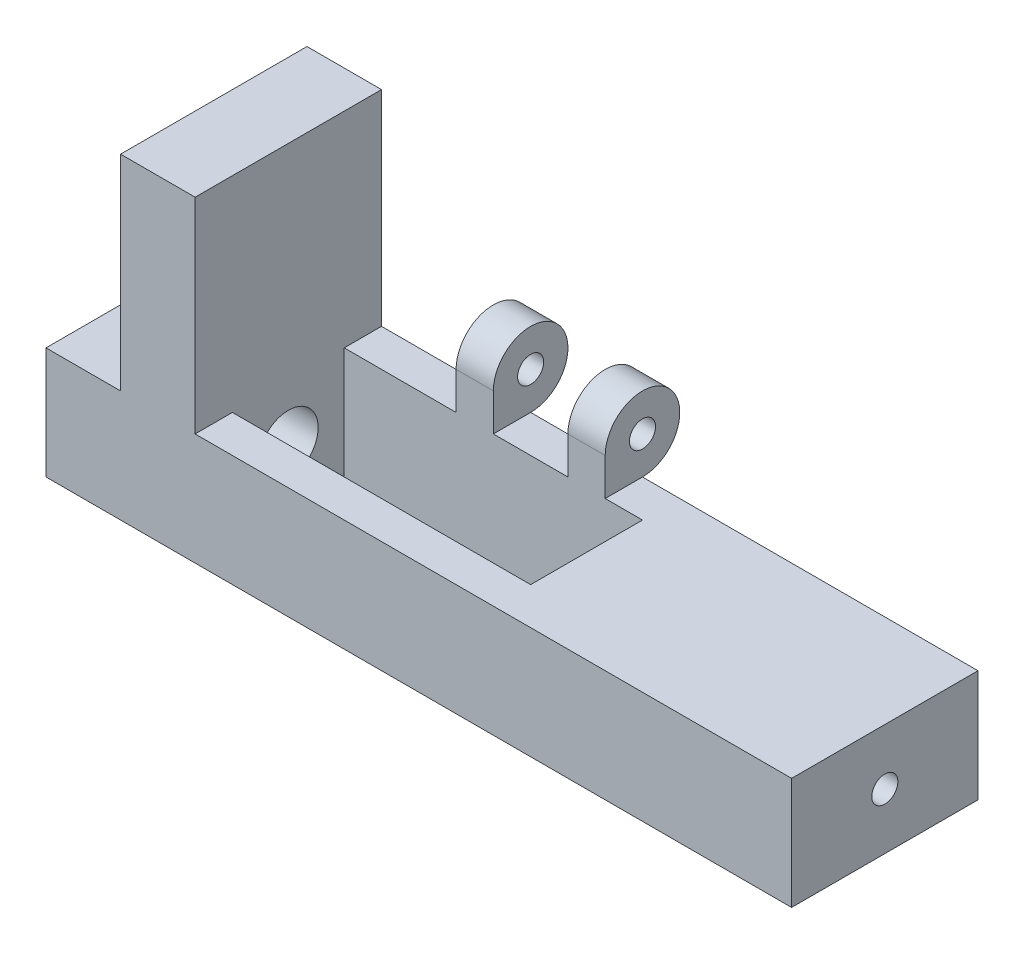
ISO-10303-21;
HEADER;
FILE_DESCRIPTION(('STEP AP214'),'2;1');
FILE_NAME('part.step','',(''),(''),'','','');
FILE_SCHEMA(('AUTOMOTIVE_DESIGN { 1 0 10303 214 1 1 1 1 }'));
ENDSEC;
DATA;
#1=APPLICATION_CONTEXT('core data for automotive mechanical design processes');
#2=APPLICATION_PROTOCOL_DEFINITION('international standard','automotive_design',2000,#1);
#3=PRODUCT_CONTEXT('',#1,'mechanical');
#4=PRODUCT('Part','Part','',(#3));
#5=PRODUCT_RELATED_PRODUCT_CATEGORY('part','',(#4));
#6=PRODUCT_DEFINITION_FORMATION('','',#4);
#7=PRODUCT_DEFINITION_CONTEXT('part definition',#1,'design');
#8=PRODUCT_DEFINITION('design','',#6,#7);
#9=PRODUCT_DEFINITION_SHAPE('','',#8);
#10=(LENGTH_UNIT() NAMED_UNIT(*) SI_UNIT(.MILLI.,.METRE.));
#11=(NAMED_UNIT(*) PLANE_ANGLE_UNIT() SI_UNIT($,.RADIAN.));
#12=(NAMED_UNIT(*) SI_UNIT($,.STERADIAN.) SOLID_ANGLE_UNIT());
#13=UNCERTAINTY_MEASURE_WITH_UNIT(LENGTH_MEASURE(1.E-05),#10,'distance_accuracy_value','');
#14=(GEOMETRIC_REPRESENTATION_CONTEXT(3) GLOBAL_UNCERTAINTY_ASSIGNED_CONTEXT((#13)) GLOBAL_UNIT_ASSIGNED_CONTEXT((#10,
#11,#12)) REPRESENTATION_CONTEXT('',''));
#15=CARTESIAN_POINT('',(0.,0.,0.));
#16=DIRECTION('',(0.,0.,1.));
#17=DIRECTION('',(1.,0.,0.));
#18=AXIS2_PLACEMENT_3D('',#15,#16,#17);
#19=CARTESIAN_POINT('',(-20.,15.,-7.5));
#20=DIRECTION('',(0.,0.,1.));
#21=DIRECTION('',(1.,0.,0.));
#22=AXIS2_PLACEMENT_3D('',#19,#20,#21);
#23=PLANE('',#22);
#24=DIRECTION('',(-1.,0.,0.));
#25=VECTOR('',#24,1.);
#26=CARTESIAN_POINT('',(20.,20.,-7.5));
#27=LINE('',#26,#25);
#28=CARTESIAN_POINT('',(0.,20.,-7.5));
#29=VERTEX_POINT('',#28);
#30=CARTESIAN_POINT('',(-5.,20.,-7.5));
#31=VERTEX_POINT('',#30);
#32=EDGE_CURVE('E255',#29,#31,#27,.T.);
#33=ORIENTED_EDGE('',*,*,#32,.T.);
#34=DIRECTION('',(0.,-1.,0.));
#35=VECTOR('',#34,1.);
#36=CARTESIAN_POINT('',(-5.,42.501,-7.5));
#37=LINE('',#36,#35);
#38=CARTESIAN_POINT('',(-5.,15.,-7.5));
#39=VERTEX_POINT('',#38);
#40=EDGE_CURVE('E194',#31,#39,#37,.T.);
#41=ORIENTED_EDGE('',*,*,#40,.T.);
#42=DIRECTION('',(1.,0.,0.));
#43=VECTOR('',#42,1.);
#44=CARTESIAN_POINT('',(-20.,15.,-7.5));
#45=LINE('',#44,#43);
#46=CARTESIAN_POINT('',(-20.,15.,-7.5));
#47=VERTEX_POINT('',#46);
#48=EDGE_CURVE('E201',#47,#39,#45,.T.);
#49=ORIENTED_EDGE('',*,*,#48,.F.);
#50=DIRECTION('',(0.,-1.,0.));
#51=VECTOR('',#50,1.);
#52=CARTESIAN_POINT('',(-20.,15.,-7.5));
#53=LINE('',#52,#51);
#54=CARTESIAN_POINT('',(-20.,0.,-7.5));
#55=VERTEX_POINT('',#54);
#56=EDGE_CURVE('E200',#47,#55,#53,.T.);
#57=ORIENTED_EDGE('',*,*,#56,.T.);
#58=DIRECTION('',(-1.,0.,0.));
#59=VECTOR('',#58,1.);
#60=CARTESIAN_POINT('',(-20.,0.,-7.5));
#61=LINE('',#60,#59);
#62=CARTESIAN_POINT('',(20.,0.,-7.5));
#63=VERTEX_POINT('',#62);
#64=EDGE_CURVE('E310',#63,#55,#61,.T.);
#65=ORIENTED_EDGE('',*,*,#64,.F.);
#66=DIRECTION('',(0.,-1.,0.));
#67=VECTOR('',#66,1.);
#68=CARTESIAN_POINT('',(20.,15.,-7.5));
#69=LINE('',#68,#67);
#70=CARTESIAN_POINT('',(20.,15.,-7.5));
#71=VERTEX_POINT('',#70);
#72=EDGE_CURVE('E323',#71,#63,#69,.T.);
#73=ORIENTED_EDGE('',*,*,#72,.F.);
#74=DIRECTION('',(1.,0.,0.));
#75=VECTOR('',#74,1.);
#76=CARTESIAN_POINT('',(20.,15.,-7.5));
#77=LINE('',#76,#75);
#78=CARTESIAN_POINT('',(15.,15.,-7.5));
#79=VERTEX_POINT('',#78);
#80=EDGE_CURVE('E246',#79,#71,#77,.T.);
#81=ORIENTED_EDGE('',*,*,#80,.F.);
#82=DIRECTION('',(0.,-1.,0.));
#83=VECTOR('',#82,1.);
#84=CARTESIAN_POINT('',(15.,42.501,-7.5));
#85=LINE('',#84,#83);
#86=CARTESIAN_POINT('',(15.,20.,-7.5));
#87=VERTEX_POINT('',#86);
#88=EDGE_CURVE('E244',#87,#79,#85,.T.);
#89=ORIENTED_EDGE('',*,*,#88,.F.);
#90=CARTESIAN_POINT('',(10.,20.,-7.5));
#91=VERTEX_POINT('',#90);
#92=EDGE_CURVE('E258',#87,#91,#27,.T.);
#93=ORIENTED_EDGE('',*,*,#92,.T.);
#94=DIRECTION('',(0.,-1.,0.));
#95=VECTOR('',#94,1.);
#96=CARTESIAN_POINT('',(10.,42.501,-7.5));
#97=LINE('',#96,#95);
#98=CARTESIAN_POINT('',(10.,15.,-7.5));
#99=VERTEX_POINT('',#98);
#100=EDGE_CURVE('E224',#91,#99,#97,.T.);
#101=ORIENTED_EDGE('',*,*,#100,.T.);
#102=DIRECTION('',(1.,0.,0.));
#103=VECTOR('',#102,1.);
#104=CARTESIAN_POINT('',(0.,15.,-7.5));
#105=LINE('',#104,#103);
#106=CARTESIAN_POINT('',(0.,15.,-7.5));
#107=VERTEX_POINT('',#106);
#108=EDGE_CURVE('E228',#107,#99,#105,.T.);
#109=ORIENTED_EDGE('',*,*,#108,.F.);
#110=DIRECTION('',(0.,-1.,0.));
#111=VECTOR('',#110,1.);
#112=CARTESIAN_POINT('',(0.,42.501,-7.5));
#113=LINE('',#112,#111);
#114=EDGE_CURVE('E222',#29,#107,#113,.T.);
#115=ORIENTED_EDGE('',*,*,#114,.F.);
#116=EDGE_LOOP('',(#33,#41,#49,#57,#65,#73,#81,#89,#93,#101,#109,#115));
#117=FACE_BOUND('',#116,.T.);
#118=ADVANCED_FACE('F39',(#117),#23,.T.);
#119=CARTESIAN_POINT('',(20.,20.,-12.5));
#120=DIRECTION('',(-1.,0.,0.));
#121=DIRECTION('',(0.,0.,1.));
#122=AXIS2_PLACEMENT_3D('',#119,#120,#121);
#123=CYLINDRICAL_SURFACE('',#122,5.);
#124=CARTESIAN_POINT('',(-5.,20.,-12.5));
#125=DIRECTION('',(-1.,0.,0.));
#126=DIRECTION('',(0.,0.,1.));
#127=AXIS2_PLACEMENT_3D('',#124,#125,#126);
#128=CIRCLE('',#127,5.);
#129=CARTESIAN_POINT('',(-5.,15.,-12.5));
#130=VERTEX_POINT('',#129);
#131=EDGE_CURVE('E202',#130,#31,#128,.F.);
#132=ORIENTED_EDGE('',*,*,#131,.T.);
#133=ORIENTED_EDGE('',*,*,#32,.F.);
#134=CARTESIAN_POINT('',(0.,20.,-12.5));
#135=DIRECTION('',(1.,0.,0.));
#136=DIRECTION('',(0.,0.,-1.));
#137=AXIS2_PLACEMENT_3D('',#134,#135,#136);
#138=CIRCLE('',#137,5.);
#139=CARTESIAN_POINT('',(0.,15.,-12.5));
#140=VERTEX_POINT('',#139);
#141=EDGE_CURVE('E206',#29,#140,#138,.F.);
#142=ORIENTED_EDGE('',*,*,#141,.T.);
#143=DIRECTION('',(-1.,0.,0.));
#144=VECTOR('',#143,1.);
#145=CARTESIAN_POINT('',(20.,15.,-12.5));
#146=LINE('',#145,#144);
#147=EDGE_CURVE('E214',#140,#130,#146,.T.);
#148=ORIENTED_EDGE('',*,*,#147,.T.);
#149=EDGE_LOOP('',(#132,#133,#142,#148));
#150=FACE_BOUND('',#149,.T.);
#151=ADVANCED_FACE('F380',(#150),#123,.T.);
#152=CARTESIAN_POINT('',(10.,20.,-12.5));
#153=DIRECTION('',(-1.,0.,0.));
#154=DIRECTION('',(0.,0.,1.));
#155=AXIS2_PLACEMENT_3D('',#152,#153,#154);
#156=CIRCLE('',#155,5.);
#157=CARTESIAN_POINT('',(10.,15.,-12.5));
#158=VERTEX_POINT('',#157);
#159=EDGE_CURVE('E233',#158,#91,#156,.F.);
#160=ORIENTED_EDGE('',*,*,#159,.T.);
#161=ORIENTED_EDGE('',*,*,#92,.F.);
#162=CARTESIAN_POINT('',(15.,20.,-12.5));
#163=DIRECTION('',(1.,0.,0.));
#164=DIRECTION('',(0.,0.,-1.));
#165=AXIS2_PLACEMENT_3D('',#162,#163,#164);
#166=CIRCLE('',#165,5.);
#167=CARTESIAN_POINT('',(15.,15.,-12.5));
#168=VERTEX_POINT('',#167);
#169=EDGE_CURVE('E236',#87,#168,#166,.F.);
#170=ORIENTED_EDGE('',*,*,#169,.T.);
#171=EDGE_CURVE('E254',#168,#158,#146,.T.);
#172=ORIENTED_EDGE('',*,*,#171,.T.);
#173=EDGE_LOOP('',(#160,#161,#170,#172));
#174=FACE_BOUND('',#173,.T.);
#175=ADVANCED_FACE('F383',(#174),#123,.T.);
#176=CARTESIAN_POINT('',(0.,15.,0.));
#177=DIRECTION('',(0.,-1.,0.));
#178=DIRECTION('',(0.,0.,-1.));
#179=AXIS2_PLACEMENT_3D('',#176,#177,#178);
#180=PLANE('',#179);
#181=CARTESIAN_POINT('',(-35.,15.,0.));
#182=DIRECTION('',(0.,1.,0.));
#183=DIRECTION('',(0.,0.,1.));
#184=AXIS2_PLACEMENT_3D('',#181,#182,#183);
#185=CIRCLE('',#184,1.625);
#186=CARTESIAN_POINT('',(-35.,15.,1.625));
#187=VERTEX_POINT('',#186);
#188=EDGE_CURVE('E278',#187,#187,#185,.T.);
#189=ORIENTED_EDGE('',*,*,#188,.F.);
#190=EDGE_LOOP('',(#189));
#191=FACE_BOUND('',#190,.T.);
#192=DIRECTION('',(0.,0.,1.));
#193=VECTOR('',#192,1.);
#194=CARTESIAN_POINT('',(-30.,15.,-12.5));
#195=LINE('',#194,#193);
#196=CARTESIAN_POINT('',(-30.,15.,-12.5));
#197=VERTEX_POINT('',#196);
#198=CARTESIAN_POINT('',(-30.,15.,12.5));
#199=VERTEX_POINT('',#198);
#200=EDGE_CURVE('E69',#197,#199,#195,.T.);
#201=ORIENTED_EDGE('',*,*,#200,.F.);
#202=DIRECTION('',(-1.,0.,0.));
#203=VECTOR('',#202,1.);
#204=CARTESIAN_POINT('',(-40.,15.,-12.5));
#205=LINE('',#204,#203);
#206=CARTESIAN_POINT('',(-40.,15.,-12.5));
#207=VERTEX_POINT('',#206);
#208=EDGE_CURVE('E336',#197,#207,#205,.T.);
#209=ORIENTED_EDGE('',*,*,#208,.T.);
#210=DIRECTION('',(0.,0.,1.));
#211=VECTOR('',#210,1.);
#212=CARTESIAN_POINT('',(-40.,15.,12.5));
#213=LINE('',#212,#211);
#214=CARTESIAN_POINT('',(-40.,15.,12.5));
#215=VERTEX_POINT('',#214);
#216=EDGE_CURVE('E327',#207,#215,#213,.T.);
#217=ORIENTED_EDGE('',*,*,#216,.T.);
#218=DIRECTION('',(1.,0.,0.));
#219=VECTOR('',#218,1.);
#220=CARTESIAN_POINT('',(-40.,15.,12.5));
#221=LINE('',#220,#219);
#222=EDGE_CURVE('E332',#215,#199,#221,.T.);
#223=ORIENTED_EDGE('',*,*,#222,.T.);
#224=EDGE_LOOP('',(#201,#209,#217,#223));
#225=FACE_BOUND('',#224,.T.);
#226=ADVANCED_FACE('F425',(#191,#225),#180,.F.);
#227=CARTESIAN_POINT('',(60.,15.,-12.5));
#228=VERTEX_POINT('',#227);
#229=EDGE_CURVE('E337',#228,#168,#205,.T.);
#230=ORIENTED_EDGE('',*,*,#229,.T.);
#231=DIRECTION('',(0.,0.,1.));
#232=VECTOR('',#231,1.);
#233=CARTESIAN_POINT('',(15.,15.,-17.5));
#234=LINE('',#233,#232);
#235=EDGE_CURVE('E248',#168,#79,#234,.T.);
#236=ORIENTED_EDGE('',*,*,#235,.T.);
#237=ORIENTED_EDGE('',*,*,#80,.T.);
#238=DIRECTION('',(0.,0.,-1.));
#239=VECTOR('',#238,1.);
#240=CARTESIAN_POINT('',(20.,15.,7.5));
#241=LINE('',#240,#239);
#242=CARTESIAN_POINT('',(20.,15.,7.5));
#243=VERTEX_POINT('',#242);
#244=EDGE_CURVE('E301',#243,#71,#241,.T.);
#245=ORIENTED_EDGE('',*,*,#244,.F.);
#246=DIRECTION('',(1.,0.,0.));
#247=VECTOR('',#246,1.);
#248=CARTESIAN_POINT('',(-20.,15.,7.5));
#249=LINE('',#248,#247);
#250=CARTESIAN_POINT('',(-20.,15.,7.5));
#251=VERTEX_POINT('',#250);
#252=EDGE_CURVE('E304',#251,#243,#249,.T.);
#253=ORIENTED_EDGE('',*,*,#252,.F.);
#254=DIRECTION('',(0.,0.,-1.));
#255=VECTOR('',#254,1.);
#256=CARTESIAN_POINT('',(-20.,15.,-12.5));
#257=LINE('',#256,#255);
#258=CARTESIAN_POINT('',(-20.,15.,12.5));
#259=VERTEX_POINT('',#258);
#260=EDGE_CURVE('E263',#259,#251,#257,.T.);
#261=ORIENTED_EDGE('',*,*,#260,.F.);
#262=CARTESIAN_POINT('',(60.,15.,12.5));
#263=VERTEX_POINT('',#262);
#264=EDGE_CURVE('E330',#259,#263,#221,.T.);
#265=ORIENTED_EDGE('',*,*,#264,.T.);
#266=DIRECTION('',(0.,0.,-1.));
#267=VECTOR('',#266,1.);
#268=CARTESIAN_POINT('',(60.,15.,12.5));
#269=LINE('',#268,#267);
#270=EDGE_CURVE('E334',#263,#228,#269,.T.);
#271=ORIENTED_EDGE('',*,*,#270,.T.);
#272=EDGE_LOOP('',(#230,#236,#237,#245,#253,#261,#265,#271));
#273=FACE_BOUND('',#272,.T.);
#274=ADVANCED_FACE('F428',(#273),#180,.F.);
#275=CARTESIAN_POINT('',(0.,0.,0.));
#276=DIRECTION('',(0.,-1.,0.));
#277=DIRECTION('',(0.,0.,-1.));
#278=AXIS2_PLACEMENT_3D('',#275,#276,#277);
#279=PLANE('',#278);
#280=DIRECTION('',(1.,0.,0.));
#281=VECTOR('',#280,1.);
#282=CARTESIAN_POINT('',(-20.,0.,7.5));
#283=LINE('',#282,#281);
#284=CARTESIAN_POINT('',(-20.,0.,7.5));
#285=VERTEX_POINT('',#284);
#286=CARTESIAN_POINT('',(20.,0.,7.5));
#287=VERTEX_POINT('',#286);
#288=EDGE_CURVE('E305',#285,#287,#283,.T.);
#289=ORIENTED_EDGE('',*,*,#288,.T.);
#290=DIRECTION('',(0.,0.,-1.));
#291=VECTOR('',#290,1.);
#292=CARTESIAN_POINT('',(20.,0.,7.5));
#293=LINE('',#292,#291);
#294=EDGE_CURVE('E300',#287,#63,#293,.T.);
#295=ORIENTED_EDGE('',*,*,#294,.T.);
#296=ORIENTED_EDGE('',*,*,#64,.T.);
#297=DIRECTION('',(0.,0.,1.));
#298=VECTOR('',#297,1.);
#299=CARTESIAN_POINT('',(-20.,0.,7.5));
#300=LINE('',#299,#298);
#301=EDGE_CURVE('E313',#55,#285,#300,.T.);
#302=ORIENTED_EDGE('',*,*,#301,.T.);
#303=EDGE_LOOP('',(#289,#295,#296,#302));
#304=FACE_BOUND('',#303,.T.);
#305=DIRECTION('',(0.,0.,1.));
#306=VECTOR('',#305,1.);
#307=CARTESIAN_POINT('',(-40.,0.,12.5));
#308=LINE('',#307,#306);
#309=CARTESIAN_POINT('',(-40.,0.,-12.5));
#310=VERTEX_POINT('',#309);
#311=CARTESIAN_POINT('',(-40.,0.,12.5));
#312=VERTEX_POINT('',#311);
#313=EDGE_CURVE('E326',#310,#312,#308,.T.);
#314=ORIENTED_EDGE('',*,*,#313,.F.);
#315=DIRECTION('',(-1.,0.,0.));
#316=VECTOR('',#315,1.);
#317=CARTESIAN_POINT('',(-40.,0.,-12.5));
#318=LINE('',#317,#316);
#319=CARTESIAN_POINT('',(60.,0.,-12.5));
#320=VERTEX_POINT('',#319);
#321=EDGE_CURVE('E331',#320,#310,#318,.T.);
#322=ORIENTED_EDGE('',*,*,#321,.F.);
#323=DIRECTION('',(0.,0.,-1.));
#324=VECTOR('',#323,1.);
#325=CARTESIAN_POINT('',(60.,0.,12.5));
#326=LINE('',#325,#324);
#327=CARTESIAN_POINT('',(60.,0.,12.5));
#328=VERTEX_POINT('',#327);
#329=EDGE_CURVE('E344',#328,#320,#326,.T.);
#330=ORIENTED_EDGE('',*,*,#329,.F.);
#331=DIRECTION('',(1.,0.,0.));
#332=VECTOR('',#331,1.);
#333=CARTESIAN_POINT('',(-40.,0.,12.5));
#334=LINE('',#333,#332);
#335=EDGE_CURVE('E342',#312,#328,#334,.T.);
#336=ORIENTED_EDGE('',*,*,#335,.F.);
#337=EDGE_LOOP('',(#314,#322,#330,#336));
#338=FACE_BOUND('',#337,.T.);
#339=CARTESIAN_POINT('',(-35.,0.,0.));
#340=DIRECTION('',(0.,1.,0.));
#341=DIRECTION('',(0.,0.,1.));
#342=AXIS2_PLACEMENT_3D('',#339,#340,#341);
#343=CIRCLE('',#342,1.6);
#344=CARTESIAN_POINT('',(-35.,0.,1.6));
#345=VERTEX_POINT('',#344);
#346=EDGE_CURVE('E284',#345,#345,#343,.T.);
#347=ORIENTED_EDGE('',*,*,#346,.T.);
#348=EDGE_LOOP('',(#347));
#349=FACE_BOUND('',#348,.T.);
#350=ADVANCED_FACE('F430',(#304,#338,#349),#279,.T.);
#351=CARTESIAN_POINT('',(-40.,15.,12.5));
#352=DIRECTION('',(1.,0.,0.));
#353=DIRECTION('',(0.,0.,-1.));
#354=AXIS2_PLACEMENT_3D('',#351,#352,#353);
#355=PLANE('',#354);
#356=CARTESIAN_POINT('',(-40.,7.5,0.));
#357=DIRECTION('',(-1.,0.,0.));
#358=DIRECTION('',(0.,0.,1.));
#359=AXIS2_PLACEMENT_3D('',#356,#357,#358);
#360=CIRCLE('',#359,4.);
#361=CARTESIAN_POINT('',(-40.,7.5,4.));
#362=VERTEX_POINT('',#361);
#363=EDGE_CURVE('E288',#362,#362,#360,.T.);
#364=ORIENTED_EDGE('',*,*,#363,.F.);
#365=EDGE_LOOP('',(#364));
#366=FACE_BOUND('',#365,.T.);
#367=ORIENTED_EDGE('',*,*,#313,.T.);
#368=DIRECTION('',(0.,-1.,0.));
#369=VECTOR('',#368,1.);
#370=CARTESIAN_POINT('',(-40.,15.,12.5));
#371=LINE('',#370,#369);
#372=EDGE_CURVE('E11',#215,#312,#371,.T.);
#373=ORIENTED_EDGE('',*,*,#372,.F.);
#374=ORIENTED_EDGE('',*,*,#216,.F.);
#375=DIRECTION('',(0.,-1.,0.));
#376=VECTOR('',#375,1.);
#377=CARTESIAN_POINT('',(-40.,15.,-12.5));
#378=LINE('',#377,#376);
#379=EDGE_CURVE('E339',#207,#310,#378,.T.);
#380=ORIENTED_EDGE('',*,*,#379,.T.);
#381=EDGE_LOOP('',(#367,#373,#374,#380));
#382=FACE_BOUND('',#381,.T.);
#383=ADVANCED_FACE('F41',(#366,#382),#355,.F.);
#384=CARTESIAN_POINT('',(-40.,15.,12.5));
#385=DIRECTION('',(0.,0.,-1.));
#386=DIRECTION('',(-1.,0.,0.));
#387=AXIS2_PLACEMENT_3D('',#384,#385,#386);
#388=PLANE('',#387);
#389=ORIENTED_EDGE('',*,*,#335,.T.);
#390=DIRECTION('',(0.,-1.,0.));
#391=VECTOR('',#390,1.);
#392=CARTESIAN_POINT('',(60.,15.,12.5));
#393=LINE('',#392,#391);
#394=EDGE_CURVE('E53',#263,#328,#393,.T.);
#395=ORIENTED_EDGE('',*,*,#394,.F.);
#396=ORIENTED_EDGE('',*,*,#264,.F.);
#397=DIRECTION('',(0.,-1.,0.));
#398=VECTOR('',#397,1.);
#399=CARTESIAN_POINT('',(-20.,42.5,12.5));
#400=LINE('',#399,#398);
#401=CARTESIAN_POINT('',(-20.,42.5,12.5));
#402=VERTEX_POINT('',#401);
#403=EDGE_CURVE('E183',#402,#259,#400,.T.);
#404=ORIENTED_EDGE('',*,*,#403,.F.);
#405=DIRECTION('',(1.,0.,0.));
#406=VECTOR('',#405,1.);
#407=CARTESIAN_POINT('',(-30.,42.5,12.5));
#408=LINE('',#407,#406);
#409=CARTESIAN_POINT('',(-30.,42.5,12.5));
#410=VERTEX_POINT('',#409);
#411=EDGE_CURVE('E262',#410,#402,#408,.T.);
#412=ORIENTED_EDGE('',*,*,#411,.F.);
#413=DIRECTION('',(0.,-1.,0.));
#414=VECTOR('',#413,1.);
#415=CARTESIAN_POINT('',(-30.,42.5,12.5));
#416=LINE('',#415,#414);
#417=EDGE_CURVE('E275',#410,#199,#416,.T.);
#418=ORIENTED_EDGE('',*,*,#417,.T.);
#419=ORIENTED_EDGE('',*,*,#222,.F.);
#420=ORIENTED_EDGE('',*,*,#372,.T.);
#421=EDGE_LOOP('',(#389,#395,#396,#404,#412,#418,#419,#420));
#422=FACE_BOUND('',#421,.T.);
#423=ADVANCED_FACE('F438',(#422),#388,.F.);
#424=CARTESIAN_POINT('',(60.,15.,12.5));
#425=DIRECTION('',(-1.,0.,0.));
#426=DIRECTION('',(0.,0.,1.));
#427=AXIS2_PLACEMENT_3D('',#424,#425,#426);
#428=PLANE('',#427);
#429=CARTESIAN_POINT('',(60.,7.5,0.));
#430=DIRECTION('',(1.,0.,0.));
#431=DIRECTION('',(0.,0.,-1.));
#432=AXIS2_PLACEMENT_3D('',#429,#430,#431);
#433=CIRCLE('',#432,1.75);
#434=CARTESIAN_POINT('',(60.,7.5,-1.75));
#435=VERTEX_POINT('',#434);
#436=EDGE_CURVE('E297',#435,#435,#433,.T.);
#437=ORIENTED_EDGE('',*,*,#436,.F.);
#438=EDGE_LOOP('',(#437));
#439=FACE_BOUND('',#438,.T.);
#440=ORIENTED_EDGE('',*,*,#329,.T.);
#441=DIRECTION('',(0.,-1.,0.));
#442=VECTOR('',#441,1.);
#443=CARTESIAN_POINT('',(60.,15.,-12.5));
#444=LINE('',#443,#442);
#445=EDGE_CURVE('E349',#228,#320,#444,.T.);
#446=ORIENTED_EDGE('',*,*,#445,.F.);
#447=ORIENTED_EDGE('',*,*,#270,.F.);
#448=ORIENTED_EDGE('',*,*,#394,.T.);
#449=EDGE_LOOP('',(#440,#446,#447,#448));
#450=FACE_BOUND('',#449,.T.);
#451=ADVANCED_FACE('F436',(#439,#450),#428,.F.);
#452=CARTESIAN_POINT('',(-40.,15.,-12.5));
#453=DIRECTION('',(0.,0.,1.));
#454=DIRECTION('',(1.,0.,0.));
#455=AXIS2_PLACEMENT_3D('',#452,#453,#454);
#456=PLANE('',#455);
#457=ORIENTED_EDGE('',*,*,#321,.T.);
#458=ORIENTED_EDGE('',*,*,#379,.F.);
#459=ORIENTED_EDGE('',*,*,#208,.F.);
#460=DIRECTION('',(0.,-1.,0.));
#461=VECTOR('',#460,1.);
#462=CARTESIAN_POINT('',(-30.,42.5,-12.5));
#463=LINE('',#462,#461);
#464=CARTESIAN_POINT('',(-30.,42.5,-12.5));
#465=VERTEX_POINT('',#464);
#466=EDGE_CURVE('E184',#465,#197,#463,.T.);
#467=ORIENTED_EDGE('',*,*,#466,.F.);
#468=DIRECTION('',(-1.,0.,0.));
#469=VECTOR('',#468,1.);
#470=CARTESIAN_POINT('',(-30.,42.5,-12.5));
#471=LINE('',#470,#469);
#472=CARTESIAN_POINT('',(-20.,42.5,-12.5));
#473=VERTEX_POINT('',#472);
#474=EDGE_CURVE('E179',#473,#465,#471,.T.);
#475=ORIENTED_EDGE('',*,*,#474,.F.);
#476=DIRECTION('',(0.,-1.,0.));
#477=VECTOR('',#476,1.);
#478=CARTESIAN_POINT('',(-20.,42.5,-12.5));
#479=LINE('',#478,#477);
#480=CARTESIAN_POINT('',(-20.,15.,-12.5));
#481=VERTEX_POINT('',#480);
#482=EDGE_CURVE('E172',#473,#481,#479,.T.);
#483=ORIENTED_EDGE('',*,*,#482,.T.);
#484=DIRECTION('',(-1.,0.,0.));
#485=VECTOR('',#484,1.);
#486=CARTESIAN_POINT('',(20.,15.,-12.5));
#487=LINE('',#486,#485);
#488=EDGE_CURVE('E176',#481,#130,#487,.F.);
#489=ORIENTED_EDGE('',*,*,#488,.T.);
#490=ORIENTED_EDGE('',*,*,#147,.F.);
#491=DIRECTION('',(-1.,0.,0.));
#492=VECTOR('',#491,1.);
#493=CARTESIAN_POINT('',(20.,15.,-12.5));
#494=LINE('',#493,#492);
#495=EDGE_CURVE('E218',#140,#158,#494,.F.);
#496=ORIENTED_EDGE('',*,*,#495,.T.);
#497=ORIENTED_EDGE('',*,*,#171,.F.);
#498=ORIENTED_EDGE('',*,*,#229,.F.);
#499=ORIENTED_EDGE('',*,*,#445,.T.);
#500=EDGE_LOOP('',(#457,#458,#459,#467,#475,#483,#489,#490,#496,#497,#498,#499));
#501=FACE_BOUND('',#500,.T.);
#502=ADVANCED_FACE('F174',(#501),#456,.F.);
#503=CARTESIAN_POINT('',(20.,15.,7.5));
#504=DIRECTION('',(-1.,0.,0.));
#505=DIRECTION('',(0.,0.,1.));
#506=AXIS2_PLACEMENT_3D('',#503,#504,#505);
#507=PLANE('',#506);
#508=CARTESIAN_POINT('',(20.,7.5,0.));
#509=DIRECTION('',(-1.,0.,0.));
#510=DIRECTION('',(0.,0.,1.));
#511=AXIS2_PLACEMENT_3D('',#508,#509,#510);
#512=CIRCLE('',#511,1.75);
#513=CARTESIAN_POINT('',(20.,7.5,1.75));
#514=VERTEX_POINT('',#513);
#515=EDGE_CURVE('E291',#514,#514,#512,.F.);
#516=ORIENTED_EDGE('',*,*,#515,.T.);
#517=EDGE_LOOP('',(#516));
#518=FACE_BOUND('',#517,.T.);
#519=ORIENTED_EDGE('',*,*,#294,.F.);
#520=DIRECTION('',(0.,-1.,0.));
#521=VECTOR('',#520,1.);
#522=CARTESIAN_POINT('',(20.,15.,7.5));
#523=LINE('',#522,#521);
#524=EDGE_CURVE('E307',#243,#287,#523,.T.);
#525=ORIENTED_EDGE('',*,*,#524,.F.);
#526=ORIENTED_EDGE('',*,*,#244,.T.);
#527=ORIENTED_EDGE('',*,*,#72,.T.);
#528=EDGE_LOOP('',(#519,#525,#526,#527));
#529=FACE_BOUND('',#528,.T.);
#530=ADVANCED_FACE('F421',(#518,#529),#507,.T.);
#531=CARTESIAN_POINT('',(-20.,15.,7.5));
#532=DIRECTION('',(1.,0.,0.));
#533=DIRECTION('',(0.,0.,-1.));
#534=AXIS2_PLACEMENT_3D('',#531,#532,#533);
#535=PLANE('',#534);
#536=ORIENTED_EDGE('',*,*,#56,.F.);
#537=DIRECTION('',(0.,0.,1.));
#538=VECTOR('',#537,1.);
#539=CARTESIAN_POINT('',(-20.,15.,-17.5));
#540=LINE('',#539,#538);
#541=EDGE_CURVE('E189',#481,#47,#540,.T.);
#542=ORIENTED_EDGE('',*,*,#541,.F.);
#543=ORIENTED_EDGE('',*,*,#482,.F.);
#544=DIRECTION('',(0.,0.,-1.));
#545=VECTOR('',#544,1.);
#546=CARTESIAN_POINT('',(-20.,42.5,-12.5));
#547=LINE('',#546,#545);
#548=EDGE_CURVE('E265',#402,#473,#547,.T.);
#549=ORIENTED_EDGE('',*,*,#548,.F.);
#550=ORIENTED_EDGE('',*,*,#403,.T.);
#551=ORIENTED_EDGE('',*,*,#260,.T.);
#552=DIRECTION('',(0.,-1.,0.));
#553=VECTOR('',#552,1.);
#554=CARTESIAN_POINT('',(-20.,15.,7.5));
#555=LINE('',#554,#553);
#556=EDGE_CURVE('E320',#251,#285,#555,.T.);
#557=ORIENTED_EDGE('',*,*,#556,.T.);
#558=ORIENTED_EDGE('',*,*,#301,.F.);
#559=EDGE_LOOP('',(#536,#542,#543,#549,#550,#551,#557,#558));
#560=FACE_BOUND('',#559,.T.);
#561=CARTESIAN_POINT('',(-20.,7.5,0.));
#562=DIRECTION('',(1.,0.,0.));
#563=DIRECTION('',(0.,0.,-1.));
#564=AXIS2_PLACEMENT_3D('',#561,#562,#563);
#565=CIRCLE('',#564,4.);
#566=CARTESIAN_POINT('',(-20.,7.5,-4.));
#567=VERTEX_POINT('',#566);
#568=EDGE_CURVE('E292',#567,#567,#565,.F.);
#569=ORIENTED_EDGE('',*,*,#568,.T.);
#570=EDGE_LOOP('',(#569));
#571=FACE_BOUND('',#570,.T.);
#572=ADVANCED_FACE('F197',(#560,#571),#535,.T.);
#573=CARTESIAN_POINT('',(-20.,15.,7.5));
#574=DIRECTION('',(0.,0.,-1.));
#575=DIRECTION('',(-1.,0.,0.));
#576=AXIS2_PLACEMENT_3D('',#573,#574,#575);
#577=PLANE('',#576);
#578=ORIENTED_EDGE('',*,*,#288,.F.);
#579=ORIENTED_EDGE('',*,*,#556,.F.);
#580=ORIENTED_EDGE('',*,*,#252,.T.);
#581=ORIENTED_EDGE('',*,*,#524,.T.);
#582=EDGE_LOOP('',(#578,#579,#580,#581));
#583=FACE_BOUND('',#582,.T.);
#584=ADVANCED_FACE('F471',(#583),#577,.T.);
#585=CARTESIAN_POINT('',(-40.001,7.5,0.));
#586=DIRECTION('',(1.,0.,0.));
#587=DIRECTION('',(0.,0.,-1.));
#588=AXIS2_PLACEMENT_3D('',#585,#586,#587);
#589=CYLINDRICAL_SURFACE('',#588,1.75);
#590=ORIENTED_EDGE('',*,*,#515,.F.);
#591=EDGE_LOOP('',(#590));
#592=FACE_BOUND('',#591,.T.);
#593=ORIENTED_EDGE('',*,*,#436,.T.);
#594=EDGE_LOOP('',(#593));
#595=FACE_BOUND('',#594,.T.);
#596=ADVANCED_FACE('F626',(#592,#595),#589,.F.);
#597=CARTESIAN_POINT('',(60.001,7.5,0.));
#598=DIRECTION('',(-1.,0.,0.));
#599=DIRECTION('',(0.,0.,1.));
#600=AXIS2_PLACEMENT_3D('',#597,#598,#599);
#601=CYLINDRICAL_SURFACE('',#600,4.);
#602=CARTESIAN_POINT('',(-35.,3.83393944403533,1.6));
#603=CARTESIAN_POINT('',(-35.0857115984799,3.83393078674863,1.59999060336303));
#604=CARTESIAN_POINT('',(-35.1715444277638,3.83089118012588,1.59307185487548));
#605=CARTESIAN_POINT('',(-35.3407478663017,3.81911268649724,1.56565522447418));
#606=CARTESIAN_POINT('',(-35.4241116136644,3.81035923690519,1.5451226435537));
#607=CARTESIAN_POINT('',(-35.585642353576,3.78831635366963,1.49138802605496));
#608=CARTESIAN_POINT('',(-35.6638276378882,3.77504402914308,1.45823372202034));
#609=CARTESIAN_POINT('',(-35.8135080406877,3.74548267923776,1.38033621549729));
#610=CARTESIAN_POINT('',(-35.8850046153207,3.72919431276861,1.335595543414));
#611=CARTESIAN_POINT('',(-36.0234083217932,3.69439307959174,1.23305757966993));
#612=CARTESIAN_POINT('',(-36.0898851383436,3.67580865633003,1.17470348618186));
#613=CARTESIAN_POINT('',(-36.2124231978523,3.63910034416951,1.04776728461923));
#614=CARTESIAN_POINT('',(-36.2684808010319,3.62097661810902,0.979181617340544));
#615=CARTESIAN_POINT('',(-36.3707251175862,3.58637273674516,0.830405048285104));
#616=CARTESIAN_POINT('',(-36.4164354411765,3.56998557053145,0.749863172489827));
#617=CARTESIAN_POINT('',(-36.4934748547118,3.54156857894763,0.581460258300099));
#618=CARTESIAN_POINT('',(-36.5248097966255,3.52953698092261,0.493602215430373));
#619=CARTESIAN_POINT('',(-36.5706731891499,3.51169339993372,0.317573141471117));
#620=CARTESIAN_POINT('',(-36.5859418512712,3.50560850579714,0.229623187843689));
#621=CARTESIAN_POINT('',(-36.6016227885302,3.49935751453837,0.0522130629101261));
#622=CARTESIAN_POINT('',(-36.6020406047479,3.4991892098455,-0.0372465326603167));
#623=CARTESIAN_POINT('',(-36.58841378418,3.50462429742571,-0.209785995772244));
#624=CARTESIAN_POINT('',(-36.5751801818024,3.50990402582531,-0.292941962299221));
#625=CARTESIAN_POINT('',(-36.5360056989514,3.52520566824968,-0.455738487374664));
#626=CARTESIAN_POINT('',(-36.5100638860797,3.5352279302311,-0.535378787512121));
#627=CARTESIAN_POINT('',(-36.445890813699,3.5592254043384,-0.690318350809319));
#628=CARTESIAN_POINT('',(-36.4074802281476,3.5732579162656,-0.765534098703701));
#629=CARTESIAN_POINT('',(-36.3196279944648,3.60388331856242,-0.908646520592454));
#630=CARTESIAN_POINT('',(-36.2701825655219,3.62047708587941,-0.976540674172882));
#631=CARTESIAN_POINT('',(-36.1578806912427,3.65582690257333,-1.10781506239372));
#632=CARTESIAN_POINT('',(-36.0943568859329,3.67465338783808,-1.17060627621891));
#633=CARTESIAN_POINT('',(-35.9576075425432,3.71150671228177,-1.28488593230825));
#634=CARTESIAN_POINT('',(-35.8843788414767,3.72953328818922,-1.33637067500772));
#635=CARTESIAN_POINT('',(-35.7276647820728,3.7632248204655,-1.42792335099434));
#636=CARTESIAN_POINT('',(-35.6439481356129,3.77880868654895,-1.46762772138792));
#637=CARTESIAN_POINT('',(-35.4702276076304,3.80489927626141,-1.53214100797301));
#638=CARTESIAN_POINT('',(-35.3802278521833,3.81540929661328,-1.55695959872352));
#639=CARTESIAN_POINT('',(-35.2023713780512,3.82936192261948,-1.58956395906556));
#640=CARTESIAN_POINT('',(-35.1147196423039,3.83319706841539,-1.59829767744672));
#641=CARTESIAN_POINT('',(-34.9391382337857,3.83448401698321,-1.60124906115921));
#642=CARTESIAN_POINT('',(-34.8512086533777,3.8319377555003,-1.5954711284743));
#643=CARTESIAN_POINT('',(-34.6828328520361,3.82115164514294,-1.57042631583082));
#644=CARTESIAN_POINT('',(-34.6022456500804,3.81324433761784,-1.55194644961876));
#645=CARTESIAN_POINT('',(-34.4453692761712,3.79303959177703,-1.50304334952902));
#646=CARTESIAN_POINT('',(-34.3690810615142,3.78074118009005,-1.47261746744191));
#647=CARTESIAN_POINT('',(-34.2195181137636,3.7525297451204,-1.39930851158516));
#648=CARTESIAN_POINT('',(-34.1464910490444,3.73649036288692,-1.35597029461167));
#649=CARTESIAN_POINT('',(-34.0084136100467,3.7027969187373,-1.2585321795535));
#650=CARTESIAN_POINT('',(-33.9433665017635,3.6851422008315,-1.20442789878559));
#651=CARTESIAN_POINT('',(-33.8181012731206,3.64863267222882,-1.08227536934439));
#652=CARTESIAN_POINT('',(-33.7585947477672,3.62978554171838,-1.01349234355608));
#653=CARTESIAN_POINT('',(-33.6518583387117,3.5942416434595,-0.866466906695077));
#654=CARTESIAN_POINT('',(-33.6046289547222,3.57754496325408,-0.788224110774293));
#655=CARTESIAN_POINT('',(-33.523961898831,3.54813027279772,-0.62422394720141));
#656=CARTESIAN_POINT('',(-33.4905209246674,3.53541131007781,-0.538468384795254));
#657=CARTESIAN_POINT('',(-33.4387609180739,3.51541829224568,-0.361914872735382));
#658=CARTESIAN_POINT('',(-33.4204336788479,3.50814128233965,-0.271119688235419));
#659=CARTESIAN_POINT('',(-33.4003962386997,3.5001679343159,-0.0934532082770477));
#660=CARTESIAN_POINT('',(-33.3976798972299,3.49907322604102,-0.0067123940744502));
#661=CARTESIAN_POINT('',(-33.4062843834273,3.50251166097126,0.165947068586588));
#662=CARTESIAN_POINT('',(-33.4176030862285,3.5070439522647,0.251865839515691));
#663=CARTESIAN_POINT('',(-33.4532374306868,3.52102789308596,0.417736721557122));
#664=CARTESIAN_POINT('',(-33.4771431568604,3.53032415492535,0.497791043718701));
#665=CARTESIAN_POINT('',(-33.5368422436495,3.5528404173437,0.652737883807145));
#666=CARTESIAN_POINT('',(-33.5726377968163,3.56606114156791,0.727629446613814));
#667=CARTESIAN_POINT('',(-33.6568825587915,3.59585524511954,0.873762433484885));
#668=CARTESIAN_POINT('',(-33.7058210359081,3.61255096217416,0.944696309445133));
#669=CARTESIAN_POINT('',(-33.8142308153431,3.64728477450842,1.07764322281925));
#670=CARTESIAN_POINT('',(-33.8737064771681,3.66532342359599,1.1396525485966));
#671=CARTESIAN_POINT('',(-34.00585217962,3.70209789152462,1.25696101206879));
#672=CARTESIAN_POINT('',(-34.0791110987209,3.72080773915693,1.31160710975922));
#673=CARTESIAN_POINT('',(-34.234353709943,3.75560262819856,1.40787796035151));
#674=CARTESIAN_POINT('',(-34.3163384263279,3.77168736090035,1.44950118231999));
#675=CARTESIAN_POINT('',(-34.4792297614785,3.79792908433673,1.51519287013864));
#676=CARTESIAN_POINT('',(-34.5595721878009,3.80848865110681,1.54050201133136));
#677=CARTESIAN_POINT('',(-34.7235883357043,3.82443197116829,1.5781742062547));
#678=CARTESIAN_POINT('',(-34.8072520927736,3.8298301434226,1.59057333431041));
#679=CARTESIAN_POINT('',(-34.9275020498703,3.83340432993892,1.59877140664814));
#680=CARTESIAN_POINT('',(-34.9637401767981,3.83394310645314,1.6000039751959));
#681=CARTESIAN_POINT('',(-35.,3.83393944403533,1.6));
#682=B_SPLINE_CURVE_WITH_KNOTS('',3,(#602,#603,#604,#605,#606,#607,#608,#609,#610,#611,#612,
#613,#614,#615,#616,#617,#618,#619,#620,#621,#622,#623,#624,#625,#626,#627,#628,#629,#630,#631,
#632,#633,#634,#635,#636,#637,#638,#639,#640,#641,#642,#643,#644,#645,#646,#647,#648,#649,#650,
#651,#652,#653,#654,#655,#656,#657,#658,#659,#660,#661,#662,#663,#664,#665,#666,#667,#668,#669,
#670,#671,#672,#673,#674,#675,#676,#677,#678,#679,#680,#681),.UNSPECIFIED.,.T.,.F.,(4,2,2,2,2,2,
2,2,2,2,2,2,2,2,2,2,2,2,2,2,2,2,2,2,2,2,2,2,2,2,2,2,2,2,2,2,2,2,2,4),(0.,0.257022119014128,
0.514701868657793,0.771416658634711,1.02807543059089,1.2980449462754,1.56810859478674,
1.84882135273142,2.12941973575583,2.39643346309746,2.66334756244537,2.91526915864241,
3.16720924103247,3.42294640187918,3.67877131952024,3.95139235265083,4.224102457017,
4.5045156697166,4.78474643835288,5.04785718014742,5.31088811921557,5.55893798463322,
5.80704286916517,6.06520923717368,6.32348091615887,6.6008298739279,6.87819011877405,
7.15548389845457,7.43262700758515,7.69168831799969,7.95071041205287,8.20177595549888,
8.45288782258074,8.71509640907146,8.97741373246571,9.25597002623698,9.53455905402557,
9.78813328650466,10.040997041706,10.1497288441658),.UNSPECIFIED.);
#683=CARTESIAN_POINT('',(-35.,3.83393944403533,1.6));
#684=VERTEX_POINT('',#683);
#685=EDGE_CURVE('E43',#684,#684,#682,.T.);
#686=ORIENTED_EDGE('',*,*,#685,.T.);
#687=EDGE_LOOP('',(#686));
#688=FACE_BOUND('',#687,.T.);
#689=CARTESIAN_POINT('',(-35.,11.1660605559647,1.6));
#690=CARTESIAN_POINT('',(-34.9142884015201,11.1660692132514,1.59999060336303));
#691=CARTESIAN_POINT('',(-34.8284555722362,11.1691088198741,1.59307185487548));
#692=CARTESIAN_POINT('',(-34.6592521336983,11.1808873135028,1.56565522447418));
#693=CARTESIAN_POINT('',(-34.5758883863356,11.1896407630948,1.5451226435537));
#694=CARTESIAN_POINT('',(-34.414357646424,11.2116836463304,1.49138802605496));
#695=CARTESIAN_POINT('',(-34.3361723621118,11.2249559708569,1.45823372202034));
#696=CARTESIAN_POINT('',(-34.1864919593123,11.2545173207622,1.38033621549729));
#697=CARTESIAN_POINT('',(-34.1149953846793,11.2708056872314,1.335595543414));
#698=CARTESIAN_POINT('',(-33.9765916782068,11.3056069204083,1.23305757966993));
#699=CARTESIAN_POINT('',(-33.9101148616564,11.32419134367,1.17470348618186));
#700=CARTESIAN_POINT('',(-33.7875768021477,11.3608996558305,1.04776728461923));
#701=CARTESIAN_POINT('',(-33.7315191989681,11.379023381891,0.979181617340544));
#702=CARTESIAN_POINT('',(-33.6292748824138,11.4136272632548,0.830405048285104));
#703=CARTESIAN_POINT('',(-33.5835645588235,11.4300144294685,0.749863172489827));
#704=CARTESIAN_POINT('',(-33.5065251452882,11.4584314210524,0.581460258300099));
#705=CARTESIAN_POINT('',(-33.4751902033744,11.4704630190774,0.493602215430372));
#706=CARTESIAN_POINT('',(-33.4293268108501,11.4883066000663,0.317573141471118));
#707=CARTESIAN_POINT('',(-33.4140581487288,11.4943914942029,0.229623187843689));
#708=CARTESIAN_POINT('',(-33.3983772114698,11.5006424854616,0.0522130629101269));
#709=CARTESIAN_POINT('',(-33.3979593952521,11.5008107901545,-0.0372465326603162));
#710=CARTESIAN_POINT('',(-33.41158621582,11.4953757025743,-0.209785995772243));
#711=CARTESIAN_POINT('',(-33.4248198181975,11.4900959741747,-0.292941962299221));
#712=CARTESIAN_POINT('',(-33.4639943010486,11.4747943317503,-0.455738487374664));
#713=CARTESIAN_POINT('',(-33.4899361139203,11.4647720697689,-0.535378787512121));
#714=CARTESIAN_POINT('',(-33.554109186301,11.4407745956616,-0.690318350809319));
#715=CARTESIAN_POINT('',(-33.5925197718524,11.4267420837344,-0.765534098703701));
#716=CARTESIAN_POINT('',(-33.6803720055352,11.3961166814376,-0.908646520592454));
#717=CARTESIAN_POINT('',(-33.7298174344781,11.3795229141206,-0.976540674172881));
#718=CARTESIAN_POINT('',(-33.8421193087573,11.3441730974267,-1.10781506239372));
#719=CARTESIAN_POINT('',(-33.9056431140671,11.3253466121619,-1.17060627621891));
#720=CARTESIAN_POINT('',(-34.0423924574568,11.2884932877182,-1.28488593230825));
#721=CARTESIAN_POINT('',(-34.1156211585233,11.2704667118108,-1.33637067500772));
#722=CARTESIAN_POINT('',(-34.2723352179272,11.2367751795345,-1.42792335099434));
#723=CARTESIAN_POINT('',(-34.3560518643871,11.221191313451,-1.46762772138792));
#724=CARTESIAN_POINT('',(-34.5297723923696,11.1951007237386,-1.53214100797301));
#725=CARTESIAN_POINT('',(-34.6197721478167,11.1845907033867,-1.55695959872352));
#726=CARTESIAN_POINT('',(-34.7976286219488,11.1706380773805,-1.58956395906556));
#727=CARTESIAN_POINT('',(-34.8852803576961,11.1668029315846,-1.59829767744673));
#728=CARTESIAN_POINT('',(-35.0608617662143,11.1655159830168,-1.60124906115921));
#729=CARTESIAN_POINT('',(-35.1487913466223,11.1680622444997,-1.5954711284743));
#730=CARTESIAN_POINT('',(-35.3171671479639,11.1788483548571,-1.57042631583082));
#731=CARTESIAN_POINT('',(-35.3977543499196,11.1867556623822,-1.55194644961877));
#732=CARTESIAN_POINT('',(-35.5546307238288,11.206960408223,-1.50304334952902));
#733=CARTESIAN_POINT('',(-35.6309189384858,11.2192588199099,-1.47261746744191));
#734=CARTESIAN_POINT('',(-35.7804818862364,11.2474702548796,-1.39930851158516));
#735=CARTESIAN_POINT('',(-35.8535089509556,11.2635096371131,-1.35597029461167));
#736=CARTESIAN_POINT('',(-35.9915863899533,11.2972030812627,-1.2585321795535));
#737=CARTESIAN_POINT('',(-36.0566334982365,11.3148577991685,-1.20442789878559));
#738=CARTESIAN_POINT('',(-36.1818987268794,11.3513673277712,-1.08227536934439));
#739=CARTESIAN_POINT('',(-36.2414052522328,11.3702144582816,-1.01349234355608));
#740=CARTESIAN_POINT('',(-36.3481416612883,11.4057583565405,-0.866466906695074));
#741=CARTESIAN_POINT('',(-36.3953710452778,11.4224550367459,-0.788224110774292));
#742=CARTESIAN_POINT('',(-36.476038101169,11.4518697272023,-0.624223947201411));
#743=CARTESIAN_POINT('',(-36.5094790753326,11.4645886899222,-0.538468384795254));
#744=CARTESIAN_POINT('',(-36.5612390819261,11.4845817077543,-0.361914872735382));
#745=CARTESIAN_POINT('',(-36.5795663211521,11.4918587176603,-0.271119688235419));
#746=CARTESIAN_POINT('',(-36.5996037613003,11.4998320656841,-0.0934532082770473));
#747=CARTESIAN_POINT('',(-36.6023201027701,11.500926773959,-0.0067123940744493));
#748=CARTESIAN_POINT('',(-36.5937156165727,11.4974883390287,0.165947068586589));
#749=CARTESIAN_POINT('',(-36.5823969137715,11.4929560477353,0.251865839515692));
#750=CARTESIAN_POINT('',(-36.5467625693132,11.478972106914,0.417736721557121));
#751=CARTESIAN_POINT('',(-36.5228568431396,11.4696758450746,0.4977910437187));
#752=CARTESIAN_POINT('',(-36.4631577563505,11.4471595826563,0.652737883807144));
#753=CARTESIAN_POINT('',(-36.4273622031837,11.4339388584321,0.727629446613813));
#754=CARTESIAN_POINT('',(-36.3431174412085,11.4041447548805,0.873762433484885));
#755=CARTESIAN_POINT('',(-36.2941789640919,11.3874490378258,0.944696309445134));
#756=CARTESIAN_POINT('',(-36.1857691846568,11.3527152254916,1.07764322281925));
#757=CARTESIAN_POINT('',(-36.1262935228319,11.334676576404,1.1396525485966));
#758=CARTESIAN_POINT('',(-35.99414782038,11.2979021084754,1.25696101206879));
#759=CARTESIAN_POINT('',(-35.9208889012791,11.2791922608431,1.31160710975922));
#760=CARTESIAN_POINT('',(-35.765646290057,11.2443973718014,1.40787796035151));
#761=CARTESIAN_POINT('',(-35.6836615736721,11.2283126390996,1.44950118231999));
#762=CARTESIAN_POINT('',(-35.5207702385215,11.2020709156633,1.51519287013864));
#763=CARTESIAN_POINT('',(-35.4404278121991,11.1915113488932,1.54050201133136));
#764=CARTESIAN_POINT('',(-35.2764116642957,11.1755680288317,1.5781742062547));
#765=CARTESIAN_POINT('',(-35.1927479072264,11.1701698565774,1.59057333431041));
#766=CARTESIAN_POINT('',(-35.0724979501297,11.1665956700611,1.59877140664814));
#767=CARTESIAN_POINT('',(-35.0362598232019,11.1660568935469,1.6000039751959));
#768=CARTESIAN_POINT('',(-35.,11.1660605559647,1.6));
#769=B_SPLINE_CURVE_WITH_KNOTS('',3,(#689,#690,#691,#692,#693,#694,#695,#696,#697,#698,#699,
#700,#701,#702,#703,#704,#705,#706,#707,#708,#709,#710,#711,#712,#713,#714,#715,#716,#717,#718,
#719,#720,#721,#722,#723,#724,#725,#726,#727,#728,#729,#730,#731,#732,#733,#734,#735,#736,#737,
#738,#739,#740,#741,#742,#743,#744,#745,#746,#747,#748,#749,#750,#751,#752,#753,#754,#755,#756,
#757,#758,#759,#760,#761,#762,#763,#764,#765,#766,#767,#768),.UNSPECIFIED.,.T.,.F.,(4,2,2,2,2,2,
2,2,2,2,2,2,2,2,2,2,2,2,2,2,2,2,2,2,2,2,2,2,2,2,2,2,2,2,2,2,2,2,2,4),(0.,0.257022119014128,
0.514701868657793,0.771416658634712,1.02807543059089,1.2980449462754,1.56810859478674,
1.84882135273142,2.12941973575583,2.39643346309746,2.66334756244537,2.91526915864241,
3.16720924103247,3.42294640187918,3.67877131952024,3.95139235265083,4.224102457017,
4.5045156697166,4.78474643835288,5.04785718014743,5.31088811921557,5.55893798463322,
5.80704286916517,6.06520923717368,6.32348091615886,6.6008298739279,6.87819011877405,
7.15548389845456,7.43262700758515,7.69168831799968,7.95071041205287,8.20177595549887,
8.45288782258074,8.71509640907146,8.9774137324657,9.25597002623696,9.53455905402557,
9.78813328650467,10.040997041706,10.1497288441658),.UNSPECIFIED.);
#770=CARTESIAN_POINT('',(-35.,11.1660605559647,1.6));
#771=VERTEX_POINT('',#770);
#772=EDGE_CURVE('E287',#771,#771,#769,.T.);
#773=ORIENTED_EDGE('',*,*,#772,.T.);
#774=EDGE_LOOP('',(#773));
#775=FACE_BOUND('',#774,.T.);
#776=ORIENTED_EDGE('',*,*,#568,.F.);
#777=EDGE_LOOP('',(#776));
#778=FACE_BOUND('',#777,.T.);
#779=ORIENTED_EDGE('',*,*,#363,.T.);
#780=EDGE_LOOP('',(#779));
#781=FACE_BOUND('',#780,.T.);
#782=ADVANCED_FACE('F357',(#688,#775,#778,#781),#601,.F.);
#783=CARTESIAN_POINT('',(-35.,15.,0.));
#784=DIRECTION('',(0.,1.,0.));
#785=DIRECTION('',(0.,0.,1.));
#786=AXIS2_PLACEMENT_3D('',#783,#784,#785);
#787=CYLINDRICAL_SURFACE('',#786,1.6);
#788=CARTESIAN_POINT('',(-35.,14.975,0.));
#789=DIRECTION('',(0.,1.,0.));
#790=DIRECTION('',(0.,0.,1.));
#791=AXIS2_PLACEMENT_3D('',#788,#789,#790);
#792=CIRCLE('',#791,1.6);
#793=CARTESIAN_POINT('',(-35.,14.975,1.6));
#794=VERTEX_POINT('',#793);
#795=EDGE_CURVE('E281',#794,#794,#792,.T.);
#796=ORIENTED_EDGE('',*,*,#795,.T.);
#797=EDGE_LOOP('',(#796));
#798=FACE_BOUND('',#797,.T.);
#799=ORIENTED_EDGE('',*,*,#772,.F.);
#800=EDGE_LOOP('',(#799));
#801=FACE_BOUND('',#800,.T.);
#802=ADVANCED_FACE('F367',(#798,#801),#787,.F.);
#803=CARTESIAN_POINT('',(-35.,15.,0.));
#804=DIRECTION('',(0.,1.,0.));
#805=DIRECTION('',(0.,0.,1.));
#806=AXIS2_PLACEMENT_3D('',#803,#804,#805);
#807=CONICAL_SURFACE('',#806,1.625,0.785398163397518);
#808=ORIENTED_EDGE('',*,*,#795,.F.);
#809=EDGE_LOOP('',(#808));
#810=FACE_BOUND('',#809,.T.);
#811=ORIENTED_EDGE('',*,*,#188,.T.);
#812=EDGE_LOOP('',(#811));
#813=FACE_BOUND('',#812,.T.);
#814=ADVANCED_FACE('F365',(#810,#813),#807,.F.);
#815=ORIENTED_EDGE('',*,*,#346,.F.);
#816=EDGE_LOOP('',(#815));
#817=FACE_BOUND('',#816,.T.);
#818=ORIENTED_EDGE('',*,*,#685,.F.);
#819=EDGE_LOOP('',(#818));
#820=FACE_BOUND('',#819,.T.);
#821=ADVANCED_FACE('F360',(#817,#820),#787,.F.);
#822=CARTESIAN_POINT('',(-30.,42.5,-12.5));
#823=DIRECTION('',(1.,0.,0.));
#824=DIRECTION('',(0.,0.,-1.));
#825=AXIS2_PLACEMENT_3D('',#822,#823,#824);
#826=PLANE('',#825);
#827=ORIENTED_EDGE('',*,*,#200,.T.);
#828=ORIENTED_EDGE('',*,*,#417,.F.);
#829=DIRECTION('',(0.,0.,1.));
#830=VECTOR('',#829,1.);
#831=CARTESIAN_POINT('',(-30.,42.5,-12.5));
#832=LINE('',#831,#830);
#833=EDGE_CURVE('E259',#465,#410,#832,.T.);
#834=ORIENTED_EDGE('',*,*,#833,.F.);
#835=ORIENTED_EDGE('',*,*,#466,.T.);
#836=EDGE_LOOP('',(#827,#828,#834,#835));
#837=FACE_BOUND('',#836,.T.);
#838=ADVANCED_FACE('F364',(#837),#826,.F.);
#839=CARTESIAN_POINT('',(0.,42.5,0.));
#840=DIRECTION('',(0.,1.,0.));
#841=DIRECTION('',(0.,0.,1.));
#842=AXIS2_PLACEMENT_3D('',#839,#840,#841);
#843=PLANE('',#842);
#844=ORIENTED_EDGE('',*,*,#833,.T.);
#845=ORIENTED_EDGE('',*,*,#411,.T.);
#846=ORIENTED_EDGE('',*,*,#548,.T.);
#847=ORIENTED_EDGE('',*,*,#474,.T.);
#848=EDGE_LOOP('',(#844,#845,#846,#847));
#849=FACE_BOUND('',#848,.T.);
#850=ADVANCED_FACE('F374',(#849),#843,.T.);
#851=CARTESIAN_POINT('',(15.,42.501,-17.5));
#852=DIRECTION('',(1.,0.,0.));
#853=DIRECTION('',(0.,0.,-1.));
#854=AXIS2_PLACEMENT_3D('',#851,#852,#853);
#855=PLANE('',#854);
#856=CARTESIAN_POINT('',(15.,20.,-12.5));
#857=DIRECTION('',(1.,0.,0.));
#858=DIRECTION('',(0.,0.,-1.));
#859=AXIS2_PLACEMENT_3D('',#856,#857,#858);
#860=CIRCLE('',#859,1.75);
#861=CARTESIAN_POINT('',(15.,20.,-14.25));
#862=VERTEX_POINT('',#861);
#863=EDGE_CURVE('E241',#862,#862,#860,.F.);
#864=ORIENTED_EDGE('',*,*,#863,.T.);
#865=EDGE_LOOP('',(#864));
#866=FACE_BOUND('',#865,.T.);
#867=ORIENTED_EDGE('',*,*,#169,.F.);
#868=ORIENTED_EDGE('',*,*,#88,.T.);
#869=ORIENTED_EDGE('',*,*,#235,.F.);
#870=EDGE_LOOP('',(#867,#868,#869));
#871=FACE_BOUND('',#870,.T.);
#872=ADVANCED_FACE('F378',(#866,#871),#855,.T.);
#873=CARTESIAN_POINT('',(0.,42.501,-17.5));
#874=DIRECTION('',(1.,0.,0.));
#875=DIRECTION('',(0.,0.,-1.));
#876=AXIS2_PLACEMENT_3D('',#873,#874,#875);
#877=PLANE('',#876);
#878=CARTESIAN_POINT('',(0.,20.,-12.5));
#879=DIRECTION('',(1.,0.,0.));
#880=DIRECTION('',(0.,0.,-1.));
#881=AXIS2_PLACEMENT_3D('',#878,#879,#880);
#882=CIRCLE('',#881,1.75);
#883=CARTESIAN_POINT('',(0.,20.,-14.25));
#884=VERTEX_POINT('',#883);
#885=EDGE_CURVE('E219',#884,#884,#882,.F.);
#886=ORIENTED_EDGE('',*,*,#885,.T.);
#887=EDGE_LOOP('',(#886));
#888=FACE_BOUND('',#887,.T.);
#889=ORIENTED_EDGE('',*,*,#141,.F.);
#890=ORIENTED_EDGE('',*,*,#114,.T.);
#891=DIRECTION('',(0.,0.,1.));
#892=VECTOR('',#891,1.);
#893=CARTESIAN_POINT('',(0.,15.,-17.5));
#894=LINE('',#893,#892);
#895=EDGE_CURVE('E230',#140,#107,#894,.T.);
#896=ORIENTED_EDGE('',*,*,#895,.F.);
#897=EDGE_LOOP('',(#889,#890,#896));
#898=FACE_BOUND('',#897,.T.);
#899=ADVANCED_FACE('F394',(#888,#898),#877,.T.);
#900=CARTESIAN_POINT('',(10.,42.501,-17.5));
#901=DIRECTION('',(-1.,0.,0.));
#902=DIRECTION('',(0.,0.,1.));
#903=AXIS2_PLACEMENT_3D('',#900,#901,#902);
#904=PLANE('',#903);
#905=CARTESIAN_POINT('',(10.,20.,-12.5));
#906=DIRECTION('',(-1.,0.,0.));
#907=DIRECTION('',(0.,0.,1.));
#908=AXIS2_PLACEMENT_3D('',#905,#906,#907);
#909=CIRCLE('',#908,1.75);
#910=CARTESIAN_POINT('',(10.,20.,-10.75));
#911=VERTEX_POINT('',#910);
#912=EDGE_CURVE('E215',#911,#911,#909,.F.);
#913=ORIENTED_EDGE('',*,*,#912,.T.);
#914=EDGE_LOOP('',(#913));
#915=FACE_BOUND('',#914,.T.);
#916=DIRECTION('',(0.,0.,-1.));
#917=VECTOR('',#916,1.);
#918=CARTESIAN_POINT('',(10.,15.,-17.5));
#919=LINE('',#918,#917);
#920=EDGE_CURVE('E61',#99,#158,#919,.T.);
#921=ORIENTED_EDGE('',*,*,#920,.F.);
#922=ORIENTED_EDGE('',*,*,#100,.F.);
#923=ORIENTED_EDGE('',*,*,#159,.F.);
#924=EDGE_LOOP('',(#921,#922,#923));
#925=FACE_BOUND('',#924,.T.);
#926=ADVANCED_FACE('F398',(#915,#925),#904,.T.);
#927=CARTESIAN_POINT('',(0.,15.,0.));
#928=DIRECTION('',(0.,1.,0.));
#929=DIRECTION('',(0.,0.,1.));
#930=AXIS2_PLACEMENT_3D('',#927,#928,#929);
#931=PLANE('',#930);
#932=ORIENTED_EDGE('',*,*,#895,.T.);
#933=ORIENTED_EDGE('',*,*,#108,.T.);
#934=ORIENTED_EDGE('',*,*,#920,.T.);
#935=ORIENTED_EDGE('',*,*,#495,.F.);
#936=EDGE_LOOP('',(#932,#933,#934,#935));
#937=FACE_BOUND('',#936,.T.);
#938=ADVANCED_FACE('F389',(#937),#931,.T.);
#939=CARTESIAN_POINT('',(20.,20.,-12.5));
#940=DIRECTION('',(-1.,0.,0.));
#941=DIRECTION('',(0.,0.,1.));
#942=AXIS2_PLACEMENT_3D('',#939,#940,#941);
#943=CYLINDRICAL_SURFACE('',#942,1.75);
#944=ORIENTED_EDGE('',*,*,#885,.F.);
#945=EDGE_LOOP('',(#944));
#946=FACE_BOUND('',#945,.T.);
#947=CARTESIAN_POINT('',(-5.,20.,-12.5));
#948=DIRECTION('',(-1.,0.,0.));
#949=DIRECTION('',(0.,0.,1.));
#950=AXIS2_PLACEMENT_3D('',#947,#948,#949);
#951=CIRCLE('',#950,1.75);
#952=CARTESIAN_POINT('',(-5.,20.,-10.75));
#953=VERTEX_POINT('',#952);
#954=EDGE_CURVE('E193',#953,#953,#951,.F.);
#955=ORIENTED_EDGE('',*,*,#954,.F.);
#956=EDGE_LOOP('',(#955));
#957=FACE_BOUND('',#956,.T.);
#958=ADVANCED_FACE('F385',(#946,#957),#943,.F.);
#959=CARTESIAN_POINT('',(-5.,42.501,-17.5));
#960=DIRECTION('',(-1.,0.,0.));
#961=DIRECTION('',(0.,0.,1.));
#962=AXIS2_PLACEMENT_3D('',#959,#960,#961);
#963=PLANE('',#962);
#964=ORIENTED_EDGE('',*,*,#954,.T.);
#965=EDGE_LOOP('',(#964));
#966=FACE_BOUND('',#965,.T.);
#967=DIRECTION('',(0.,0.,-1.));
#968=VECTOR('',#967,1.);
#969=CARTESIAN_POINT('',(-5.,15.,-17.5));
#970=LINE('',#969,#968);
#971=EDGE_CURVE('E192',#39,#130,#970,.T.);
#972=ORIENTED_EDGE('',*,*,#971,.F.);
#973=ORIENTED_EDGE('',*,*,#40,.F.);
#974=ORIENTED_EDGE('',*,*,#131,.F.);
#975=EDGE_LOOP('',(#972,#973,#974));
#976=FACE_BOUND('',#975,.T.);
#977=ADVANCED_FACE('F388',(#966,#976),#963,.T.);
#978=CARTESIAN_POINT('',(0.,15.,0.));
#979=DIRECTION('',(0.,1.,0.));
#980=DIRECTION('',(0.,0.,1.));
#981=AXIS2_PLACEMENT_3D('',#978,#979,#980);
#982=PLANE('',#981);
#983=ORIENTED_EDGE('',*,*,#541,.T.);
#984=ORIENTED_EDGE('',*,*,#48,.T.);
#985=ORIENTED_EDGE('',*,*,#971,.T.);
#986=ORIENTED_EDGE('',*,*,#488,.F.);
#987=EDGE_LOOP('',(#983,#984,#985,#986));
#988=FACE_BOUND('',#987,.T.);
#989=ADVANCED_FACE('F188',(#988),#982,.T.);
#990=ORIENTED_EDGE('',*,*,#863,.F.);
#991=EDGE_LOOP('',(#990));
#992=FACE_BOUND('',#991,.T.);
#993=ORIENTED_EDGE('',*,*,#912,.F.);
#994=EDGE_LOOP('',(#993));
#995=FACE_BOUND('',#994,.T.);
#996=ADVANCED_FACE('F391',(#992,#995),#943,.F.);
#997=CLOSED_SHELL('',(#118,#151,#175,#226,#274,#350,#383,#423,#451,#502,#530,#572,#584,#596,
#782,#802,#814,#821,#838,#850,#872,#899,#926,#938,#958,#977,#989,#996));
#998=MANIFOLD_SOLID_BREP('B2',#997);
#999=ADVANCED_BREP_SHAPE_REPRESENTATION('',(#18,#998),#14);
#1000=SHAPE_DEFINITION_REPRESENTATION(#9,#999);
ENDSEC;
END-ISO-10303-21;
